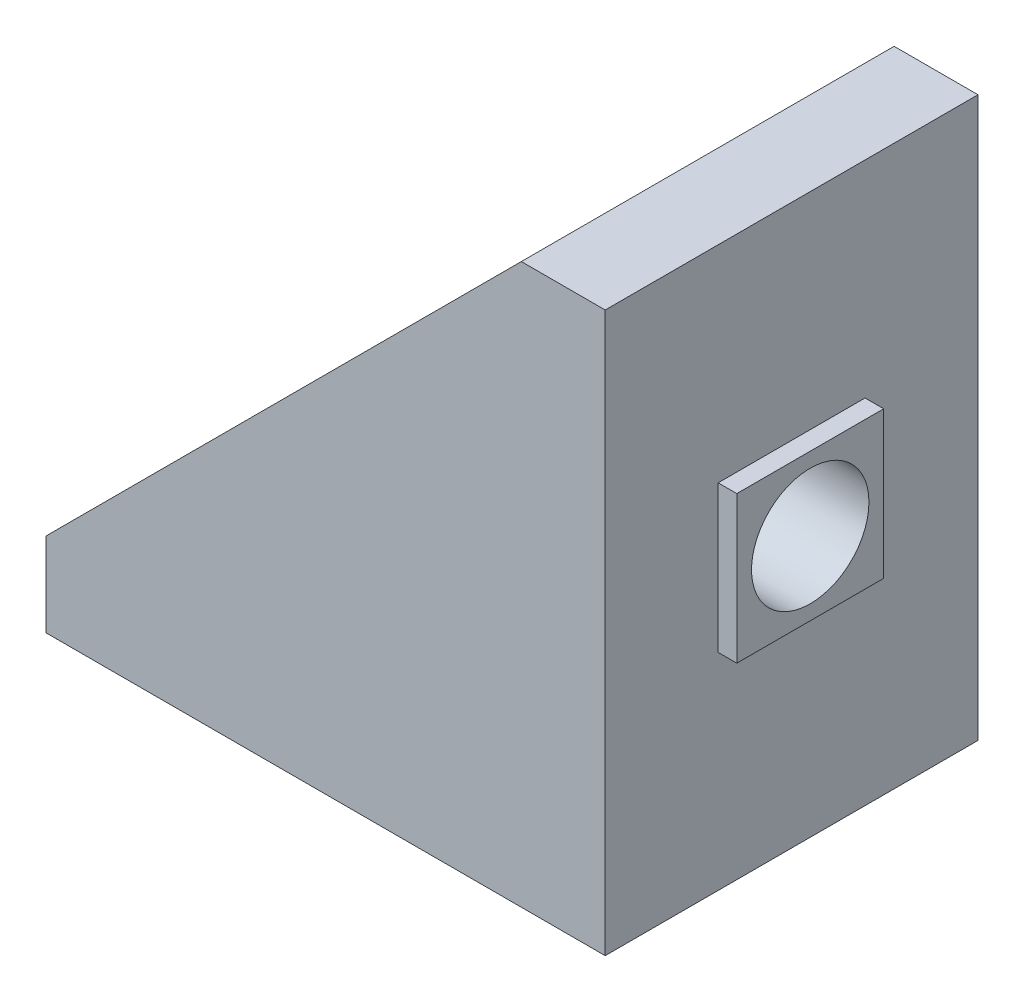
ISO-10303-21;
HEADER;
FILE_DESCRIPTION(('STEP AP214'),'2;1');
FILE_NAME('part.step','',(''),(''),'','','');
FILE_SCHEMA(('AUTOMOTIVE_DESIGN { 1 0 10303 214 1 1 1 1 }'));
ENDSEC;
DATA;
#1=APPLICATION_CONTEXT('core data for automotive mechanical design processes');
#2=APPLICATION_PROTOCOL_DEFINITION('international standard','automotive_design',2000,#1);
#3=PRODUCT_CONTEXT('',#1,'mechanical');
#4=PRODUCT('Part','Part','',(#3));
#5=PRODUCT_RELATED_PRODUCT_CATEGORY('part','',(#4));
#6=PRODUCT_DEFINITION_FORMATION('','',#4);
#7=PRODUCT_DEFINITION_CONTEXT('part definition',#1,'design');
#8=PRODUCT_DEFINITION('design','',#6,#7);
#9=PRODUCT_DEFINITION_SHAPE('','',#8);
#10=(LENGTH_UNIT() NAMED_UNIT(*) SI_UNIT(.MILLI.,.METRE.));
#11=(NAMED_UNIT(*) PLANE_ANGLE_UNIT() SI_UNIT($,.RADIAN.));
#12=(NAMED_UNIT(*) SI_UNIT($,.STERADIAN.) SOLID_ANGLE_UNIT());
#13=UNCERTAINTY_MEASURE_WITH_UNIT(LENGTH_MEASURE(1.E-05),#10,'distance_accuracy_value','');
#14=(GEOMETRIC_REPRESENTATION_CONTEXT(3) GLOBAL_UNCERTAINTY_ASSIGNED_CONTEXT((#13)) GLOBAL_UNIT_ASSIGNED_CONTEXT((#10,
#11,#12)) REPRESENTATION_CONTEXT('',''));
#15=CARTESIAN_POINT('',(0.,0.,0.));
#16=DIRECTION('',(0.,0.,1.));
#17=DIRECTION('',(1.,0.,0.));
#18=AXIS2_PLACEMENT_3D('',#15,#16,#17);
#19=CARTESIAN_POINT('',(-30.,0.,20.));
#20=DIRECTION('',(0.,1.,0.));
#21=DIRECTION('',(0.,0.,1.));
#22=AXIS2_PLACEMENT_3D('',#19,#20,#21);
#23=PLANE('',#22);
#24=CARTESIAN_POINT('',(-18.,0.,10.));
#25=DIRECTION('',(0.,-1.,0.));
#26=DIRECTION('',(0.,0.,-1.));
#27=AXIS2_PLACEMENT_3D('',#24,#25,#26);
#28=CIRCLE('',#27,3.15);
#29=CARTESIAN_POINT('',(-18.,0.,6.85));
#30=VERTEX_POINT('',#29);
#31=EDGE_CURVE('E473',#30,#30,#28,.T.);
#32=ORIENTED_EDGE('',*,*,#31,.F.);
#33=EDGE_LOOP('',(#32));
#34=FACE_BOUND('',#33,.T.);
#35=DIRECTION('',(0.,0.,-1.));
#36=VECTOR('',#35,1.);
#37=CARTESIAN_POINT('',(-25.8,0.,13.85));
#38=LINE('',#37,#36);
#39=CARTESIAN_POINT('',(-25.8,0.,13.85));
#40=VERTEX_POINT('',#39);
#41=CARTESIAN_POINT('',(-25.8,0.,6.15));
#42=VERTEX_POINT('',#41);
#43=EDGE_CURVE('E194',#40,#42,#38,.T.);
#44=ORIENTED_EDGE('',*,*,#43,.F.);
#45=DIRECTION('',(-1.,0.,0.));
#46=VECTOR('',#45,1.);
#47=CARTESIAN_POINT('',(-23.8,0.,13.85));
#48=LINE('',#47,#46);
#49=CARTESIAN_POINT('',(-23.8,0.,13.85));
#50=VERTEX_POINT('',#49);
#51=EDGE_CURVE('E207',#50,#40,#48,.T.);
#52=ORIENTED_EDGE('',*,*,#51,.F.);
#53=DIRECTION('',(0.,0.,1.));
#54=VECTOR('',#53,1.);
#55=CARTESIAN_POINT('',(-23.8,0.,13.85));
#56=LINE('',#55,#54);
#57=CARTESIAN_POINT('',(-23.8,0.,6.15));
#58=VERTEX_POINT('',#57);
#59=EDGE_CURVE('E216',#58,#50,#56,.T.);
#60=ORIENTED_EDGE('',*,*,#59,.F.);
#61=DIRECTION('',(1.,0.,0.));
#62=VECTOR('',#61,1.);
#63=CARTESIAN_POINT('',(-23.8,0.,6.15));
#64=LINE('',#63,#62);
#65=EDGE_CURVE('E197',#42,#58,#64,.T.);
#66=ORIENTED_EDGE('',*,*,#65,.F.);
#67=EDGE_LOOP('',(#44,#52,#60,#66));
#68=FACE_BOUND('',#67,.T.);
#69=DIRECTION('',(1.,0.,0.));
#70=VECTOR('',#69,1.);
#71=CARTESIAN_POINT('',(-30.,0.,0.));
#72=LINE('',#71,#70);
#73=CARTESIAN_POINT('',(-30.,0.,0.));
#74=VERTEX_POINT('',#73);
#75=CARTESIAN_POINT('',(0.,0.,0.));
#76=VERTEX_POINT('',#75);
#77=EDGE_CURVE('E316',#74,#76,#72,.T.);
#78=ORIENTED_EDGE('',*,*,#77,.T.);
#79=DIRECTION('',(0.,0.,-1.));
#80=VECTOR('',#79,1.);
#81=CARTESIAN_POINT('',(0.,0.,20.));
#82=LINE('',#81,#80);
#83=CARTESIAN_POINT('',(0.,0.,20.));
#84=VERTEX_POINT('',#83);
#85=EDGE_CURVE('E321',#84,#76,#82,.T.);
#86=ORIENTED_EDGE('',*,*,#85,.F.);
#87=DIRECTION('',(1.,0.,0.));
#88=VECTOR('',#87,1.);
#89=CARTESIAN_POINT('',(-30.,0.,20.));
#90=LINE('',#89,#88);
#91=CARTESIAN_POINT('',(-30.,0.,20.));
#92=VERTEX_POINT('',#91);
#93=EDGE_CURVE('E304',#92,#84,#90,.T.);
#94=ORIENTED_EDGE('',*,*,#93,.F.);
#95=DIRECTION('',(0.,0.,-1.));
#96=VECTOR('',#95,1.);
#97=CARTESIAN_POINT('',(-30.,0.,20.));
#98=LINE('',#97,#96);
#99=EDGE_CURVE('E324',#92,#74,#98,.T.);
#100=ORIENTED_EDGE('',*,*,#99,.T.);
#101=EDGE_LOOP('',(#78,#86,#94,#100));
#102=FACE_BOUND('',#101,.T.);
#103=DIRECTION('',(0.,0.,-1.));
#104=VECTOR('',#103,1.);
#105=CARTESIAN_POINT('',(-9.6,0.,13.85));
#106=LINE('',#105,#104);
#107=CARTESIAN_POINT('',(-9.6,0.,13.85));
#108=VERTEX_POINT('',#107);
#109=CARTESIAN_POINT('',(-9.6,0.,6.15));
#110=VERTEX_POINT('',#109);
#111=EDGE_CURVE('E193',#108,#110,#106,.T.);
#112=ORIENTED_EDGE('',*,*,#111,.F.);
#113=DIRECTION('',(-1.,0.,0.));
#114=VECTOR('',#113,1.);
#115=CARTESIAN_POINT('',(-4.59999999999999,0.,13.85));
#116=LINE('',#115,#114);
#117=CARTESIAN_POINT('',(-4.59999999999999,0.,13.85));
#118=VERTEX_POINT('',#117);
#119=EDGE_CURVE('E190',#118,#108,#116,.T.);
#120=ORIENTED_EDGE('',*,*,#119,.F.);
#121=DIRECTION('',(0.,0.,1.));
#122=VECTOR('',#121,1.);
#123=CARTESIAN_POINT('',(-4.59999999999999,0.,13.85));
#124=LINE('',#123,#122);
#125=CARTESIAN_POINT('',(-4.59999999999999,0.,6.15));
#126=VERTEX_POINT('',#125);
#127=EDGE_CURVE('E56',#126,#118,#124,.T.);
#128=ORIENTED_EDGE('',*,*,#127,.F.);
#129=DIRECTION('',(1.,0.,0.));
#130=VECTOR('',#129,1.);
#131=CARTESIAN_POINT('',(-4.59999999999999,0.,6.15));
#132=LINE('',#131,#130);
#133=EDGE_CURVE('E51',#110,#126,#132,.T.);
#134=ORIENTED_EDGE('',*,*,#133,.F.);
#135=EDGE_LOOP('',(#112,#120,#128,#134));
#136=FACE_BOUND('',#135,.T.);
#137=ADVANCED_FACE('F35',(#34,#68,#102,#136),#23,.F.);
#138=CARTESIAN_POINT('',(0.,0.,20.));
#139=DIRECTION('',(-1.,0.,0.));
#140=DIRECTION('',(0.,0.,1.));
#141=AXIS2_PLACEMENT_3D('',#138,#139,#140);
#142=PLANE('',#141);
#143=DIRECTION('',(0.,1.,0.));
#144=VECTOR('',#143,1.);
#145=CARTESIAN_POINT('',(0.,0.,0.));
#146=LINE('',#145,#144);
#147=CARTESIAN_POINT('',(0.,30.,0.));
#148=VERTEX_POINT('',#147);
#149=EDGE_CURVE('E300',#76,#148,#146,.T.);
#150=ORIENTED_EDGE('',*,*,#149,.T.);
#151=DIRECTION('',(0.,0.,-1.));
#152=VECTOR('',#151,1.);
#153=CARTESIAN_POINT('',(0.,30.,20.));
#154=LINE('',#153,#152);
#155=CARTESIAN_POINT('',(0.,30.,20.));
#156=VERTEX_POINT('',#155);
#157=EDGE_CURVE('E308',#156,#148,#154,.T.);
#158=ORIENTED_EDGE('',*,*,#157,.F.);
#159=DIRECTION('',(0.,1.,0.));
#160=VECTOR('',#159,1.);
#161=CARTESIAN_POINT('',(0.,0.,20.));
#162=LINE('',#161,#160);
#163=EDGE_CURVE('E306',#84,#156,#162,.T.);
#164=ORIENTED_EDGE('',*,*,#163,.F.);
#165=ORIENTED_EDGE('',*,*,#85,.T.);
#166=EDGE_LOOP('',(#150,#158,#164,#165));
#167=FACE_BOUND('',#166,.T.);
#168=DIRECTION('',(0.,1.,0.));
#169=VECTOR('',#168,1.);
#170=CARTESIAN_POINT('',(0.,18.94,6.05999999999999));
#171=LINE('',#170,#169);
#172=CARTESIAN_POINT('',(0.,11.06,6.05999999999999));
#173=VERTEX_POINT('',#172);
#174=CARTESIAN_POINT('',(0.,18.94,6.05999999999999));
#175=VERTEX_POINT('',#174);
#176=EDGE_CURVE('E238',#173,#175,#171,.T.);
#177=ORIENTED_EDGE('',*,*,#176,.F.);
#178=DIRECTION('',(0.,0.,-1.));
#179=VECTOR('',#178,1.);
#180=CARTESIAN_POINT('',(0.,11.06,13.94));
#181=LINE('',#180,#179);
#182=CARTESIAN_POINT('',(0.,11.06,13.94));
#183=VERTEX_POINT('',#182);
#184=EDGE_CURVE('E243',#183,#173,#181,.T.);
#185=ORIENTED_EDGE('',*,*,#184,.F.);
#186=DIRECTION('',(0.,-1.,0.));
#187=VECTOR('',#186,1.);
#188=CARTESIAN_POINT('',(0.,18.94,13.94));
#189=LINE('',#188,#187);
#190=CARTESIAN_POINT('',(0.,18.94,13.94));
#191=VERTEX_POINT('',#190);
#192=EDGE_CURVE('E255',#191,#183,#189,.T.);
#193=ORIENTED_EDGE('',*,*,#192,.F.);
#194=DIRECTION('',(0.,0.,1.));
#195=VECTOR('',#194,1.);
#196=CARTESIAN_POINT('',(0.,18.94,13.94));
#197=LINE('',#196,#195);
#198=EDGE_CURVE('E252',#175,#191,#197,.T.);
#199=ORIENTED_EDGE('',*,*,#198,.F.);
#200=EDGE_LOOP('',(#177,#185,#193,#199));
#201=FACE_BOUND('',#200,.T.);
#202=ADVANCED_FACE('F352',(#167,#201),#142,.F.);
#203=CARTESIAN_POINT('',(-4.5,30.,20.));
#204=DIRECTION('',(0.707106781186548,-0.707106781186548,0.));
#205=DIRECTION('',(0.707106781186548,0.707106781186548,0.));
#206=AXIS2_PLACEMENT_3D('',#203,#204,#205);
#207=PLANE('',#206);
#208=DIRECTION('',(0.707106781186548,0.707106781186548,0.));
#209=VECTOR('',#208,1.);
#210=CARTESIAN_POINT('',(-30.,4.5,2.));
#211=LINE('',#210,#209);
#212=CARTESIAN_POINT('',(-30.,4.5,2.));
#213=VERTEX_POINT('',#212);
#214=CARTESIAN_POINT('',(-4.5,30.,2.));
#215=VERTEX_POINT('',#214);
#216=EDGE_CURVE('E274',#213,#215,#211,.T.);
#217=ORIENTED_EDGE('',*,*,#216,.T.);
#218=DIRECTION('',(0.,0.,-1.));
#219=VECTOR('',#218,1.);
#220=CARTESIAN_POINT('',(-4.5,30.,20.));
#221=LINE('',#220,#219);
#222=CARTESIAN_POINT('',(-4.5,30.,0.));
#223=VERTEX_POINT('',#222);
#224=EDGE_CURVE('E44',#215,#223,#221,.T.);
#225=ORIENTED_EDGE('',*,*,#224,.T.);
#226=DIRECTION('',(-0.707106781186548,-0.707106781186548,0.));
#227=VECTOR('',#226,1.);
#228=CARTESIAN_POINT('',(-4.5,30.,0.));
#229=LINE('',#228,#227);
#230=CARTESIAN_POINT('',(-30.,4.5,0.));
#231=VERTEX_POINT('',#230);
#232=EDGE_CURVE('E311',#223,#231,#229,.T.);
#233=ORIENTED_EDGE('',*,*,#232,.T.);
#234=DIRECTION('',(0.,0.,-1.));
#235=VECTOR('',#234,1.);
#236=CARTESIAN_POINT('',(-30.,4.5,20.));
#237=LINE('',#236,#235);
#238=EDGE_CURVE('E327',#213,#231,#237,.T.);
#239=ORIENTED_EDGE('',*,*,#238,.F.);
#240=EDGE_LOOP('',(#217,#225,#233,#239));
#241=FACE_BOUND('',#240,.T.);
#242=ADVANCED_FACE('F340',(#241),#207,.F.);
#243=CARTESIAN_POINT('',(0.,30.,20.));
#244=DIRECTION('',(0.,-1.,0.));
#245=DIRECTION('',(0.,0.,-1.));
#246=AXIS2_PLACEMENT_3D('',#243,#244,#245);
#247=PLANE('',#246);
#248=DIRECTION('',(-1.,0.,0.));
#249=VECTOR('',#248,1.);
#250=CARTESIAN_POINT('',(0.,30.,0.));
#251=LINE('',#250,#249);
#252=EDGE_CURVE('E295',#148,#223,#251,.T.);
#253=ORIENTED_EDGE('',*,*,#252,.T.);
#254=ORIENTED_EDGE('',*,*,#224,.F.);
#255=DIRECTION('',(0.,0.,1.));
#256=VECTOR('',#255,1.);
#257=CARTESIAN_POINT('',(-4.5,30.,-36.0624458405139));
#258=LINE('',#257,#256);
#259=CARTESIAN_POINT('',(-4.5,30.,18.));
#260=VERTEX_POINT('',#259);
#261=EDGE_CURVE('E275',#215,#260,#258,.T.);
#262=ORIENTED_EDGE('',*,*,#261,.T.);
#263=CARTESIAN_POINT('',(-4.5,30.,20.));
#264=VERTEX_POINT('',#263);
#265=EDGE_CURVE('E12',#264,#260,#221,.T.);
#266=ORIENTED_EDGE('',*,*,#265,.F.);
#267=DIRECTION('',(-1.,0.,0.));
#268=VECTOR('',#267,1.);
#269=CARTESIAN_POINT('',(0.,30.,20.));
#270=LINE('',#269,#268);
#271=EDGE_CURVE('E296',#156,#264,#270,.T.);
#272=ORIENTED_EDGE('',*,*,#271,.F.);
#273=ORIENTED_EDGE('',*,*,#157,.T.);
#274=EDGE_LOOP('',(#253,#254,#262,#266,#272,#273));
#275=FACE_BOUND('',#274,.T.);
#276=ADVANCED_FACE('F37',(#275),#247,.F.);
#277=ORIENTED_EDGE('',*,*,#265,.T.);
#278=DIRECTION('',(-0.707106781186548,-0.707106781186548,0.));
#279=VECTOR('',#278,1.);
#280=CARTESIAN_POINT('',(-30.,4.5,18.));
#281=LINE('',#280,#279);
#282=CARTESIAN_POINT('',(-30.,4.5,18.));
#283=VERTEX_POINT('',#282);
#284=EDGE_CURVE('E271',#260,#283,#281,.T.);
#285=ORIENTED_EDGE('',*,*,#284,.T.);
#286=CARTESIAN_POINT('',(-30.,4.5,20.));
#287=VERTEX_POINT('',#286);
#288=EDGE_CURVE('E328',#287,#283,#237,.T.);
#289=ORIENTED_EDGE('',*,*,#288,.F.);
#290=DIRECTION('',(-0.707106781186548,-0.707106781186548,0.));
#291=VECTOR('',#290,1.);
#292=CARTESIAN_POINT('',(-4.5,30.,20.));
#293=LINE('',#292,#291);
#294=EDGE_CURVE('E299',#264,#287,#293,.T.);
#295=ORIENTED_EDGE('',*,*,#294,.F.);
#296=EDGE_LOOP('',(#277,#285,#289,#295));
#297=FACE_BOUND('',#296,.T.);
#298=ADVANCED_FACE('F360',(#297),#207,.F.);
#299=CARTESIAN_POINT('',(-30.,4.5,20.));
#300=DIRECTION('',(1.,0.,0.));
#301=DIRECTION('',(0.,0.,-1.));
#302=AXIS2_PLACEMENT_3D('',#299,#300,#301);
#303=PLANE('',#302);
#304=DIRECTION('',(0.,-1.,0.));
#305=VECTOR('',#304,1.);
#306=CARTESIAN_POINT('',(-30.,4.5,0.));
#307=LINE('',#306,#305);
#308=EDGE_CURVE('E314',#231,#74,#307,.T.);
#309=ORIENTED_EDGE('',*,*,#308,.T.);
#310=ORIENTED_EDGE('',*,*,#99,.F.);
#311=DIRECTION('',(0.,-1.,0.));
#312=VECTOR('',#311,1.);
#313=CARTESIAN_POINT('',(-30.,4.5,20.));
#314=LINE('',#313,#312);
#315=EDGE_CURVE('E302',#287,#92,#314,.T.);
#316=ORIENTED_EDGE('',*,*,#315,.F.);
#317=ORIENTED_EDGE('',*,*,#288,.T.);
#318=DIRECTION('',(0.,0.,1.));
#319=VECTOR('',#318,1.);
#320=CARTESIAN_POINT('',(-30.,4.5,-36.0624458405139));
#321=LINE('',#320,#319);
#322=EDGE_CURVE('E287',#213,#283,#321,.T.);
#323=ORIENTED_EDGE('',*,*,#322,.F.);
#324=ORIENTED_EDGE('',*,*,#238,.T.);
#325=EDGE_LOOP('',(#309,#310,#316,#317,#323,#324));
#326=FACE_BOUND('',#325,.T.);
#327=ADVANCED_FACE('F335',(#326),#303,.F.);
#328=CARTESIAN_POINT('',(0.,0.,20.));
#329=DIRECTION('',(0.,0.,1.));
#330=DIRECTION('',(1.,0.,0.));
#331=AXIS2_PLACEMENT_3D('',#328,#329,#330);
#332=PLANE('',#331);
#333=ORIENTED_EDGE('',*,*,#271,.T.);
#334=ORIENTED_EDGE('',*,*,#294,.T.);
#335=ORIENTED_EDGE('',*,*,#315,.T.);
#336=ORIENTED_EDGE('',*,*,#93,.T.);
#337=ORIENTED_EDGE('',*,*,#163,.T.);
#338=EDGE_LOOP('',(#333,#334,#335,#336,#337));
#339=FACE_BOUND('',#338,.T.);
#340=ADVANCED_FACE('F357',(#339),#332,.T.);
#341=CARTESIAN_POINT('',(0.,0.,0.));
#342=DIRECTION('',(0.,0.,1.));
#343=DIRECTION('',(1.,0.,0.));
#344=AXIS2_PLACEMENT_3D('',#341,#342,#343);
#345=PLANE('',#344);
#346=ORIENTED_EDGE('',*,*,#252,.F.);
#347=ORIENTED_EDGE('',*,*,#149,.F.);
#348=ORIENTED_EDGE('',*,*,#77,.F.);
#349=ORIENTED_EDGE('',*,*,#308,.F.);
#350=ORIENTED_EDGE('',*,*,#232,.F.);
#351=EDGE_LOOP('',(#346,#347,#348,#349,#350));
#352=FACE_BOUND('',#351,.T.);
#353=ADVANCED_FACE('F345',(#352),#345,.F.);
#354=CARTESIAN_POINT('',(-4.5,4.5,-36.0624458405139));
#355=DIRECTION('',(1.,0.,0.));
#356=DIRECTION('',(0.,0.,-1.));
#357=AXIS2_PLACEMENT_3D('',#354,#355,#356);
#358=PLANE('',#357);
#359=CARTESIAN_POINT('',(-4.5,15.,9.99999999999999));
#360=DIRECTION('',(1.,0.,0.));
#361=DIRECTION('',(0.,0.,-1.));
#362=AXIS2_PLACEMENT_3D('',#359,#360,#361);
#363=CIRCLE('',#362,3.15);
#364=CARTESIAN_POINT('',(-4.5,15.,6.84999999999999));
#365=VERTEX_POINT('',#364);
#366=EDGE_CURVE('E235',#365,#365,#363,.T.);
#367=ORIENTED_EDGE('',*,*,#366,.T.);
#368=EDGE_LOOP('',(#367));
#369=FACE_BOUND('',#368,.T.);
#370=DIRECTION('',(0.,-1.,0.));
#371=VECTOR('',#370,1.);
#372=CARTESIAN_POINT('',(-4.5,4.5,2.));
#373=LINE('',#372,#371);
#374=CARTESIAN_POINT('',(-4.5,4.5,2.));
#375=VERTEX_POINT('',#374);
#376=EDGE_CURVE('E272',#215,#375,#373,.T.);
#377=ORIENTED_EDGE('',*,*,#376,.T.);
#378=DIRECTION('',(0.,0.,1.));
#379=VECTOR('',#378,1.);
#380=CARTESIAN_POINT('',(-4.5,4.5,-36.0624458405139));
#381=LINE('',#380,#379);
#382=CARTESIAN_POINT('',(-4.5,4.5,18.));
#383=VERTEX_POINT('',#382);
#384=EDGE_CURVE('E290',#375,#383,#381,.T.);
#385=ORIENTED_EDGE('',*,*,#384,.T.);
#386=DIRECTION('',(0.,1.,0.));
#387=VECTOR('',#386,1.);
#388=CARTESIAN_POINT('',(-4.5,4.5,18.));
#389=LINE('',#388,#387);
#390=EDGE_CURVE('E284',#383,#260,#389,.T.);
#391=ORIENTED_EDGE('',*,*,#390,.T.);
#392=ORIENTED_EDGE('',*,*,#261,.F.);
#393=EDGE_LOOP('',(#377,#385,#391,#392));
#394=FACE_BOUND('',#393,.T.);
#395=ADVANCED_FACE('F367',(#369,#394),#358,.F.);
#396=CARTESIAN_POINT('',(-30.,4.5,-36.0624458405139));
#397=DIRECTION('',(0.,-1.,0.));
#398=DIRECTION('',(0.,0.,-1.));
#399=AXIS2_PLACEMENT_3D('',#396,#397,#398);
#400=PLANE('',#399);
#401=CARTESIAN_POINT('',(-18.,4.5,10.));
#402=DIRECTION('',(0.,-1.,0.));
#403=DIRECTION('',(0.,0.,-1.));
#404=AXIS2_PLACEMENT_3D('',#401,#402,#403);
#405=CIRCLE('',#404,3.15);
#406=CARTESIAN_POINT('',(-18.,4.5,6.85));
#407=VERTEX_POINT('',#406);
#408=EDGE_CURVE('E39',#407,#407,#405,.T.);
#409=ORIENTED_EDGE('',*,*,#408,.T.);
#410=EDGE_LOOP('',(#409));
#411=FACE_BOUND('',#410,.T.);
#412=DIRECTION('',(-1.,0.,0.));
#413=VECTOR('',#412,1.);
#414=CARTESIAN_POINT('',(-30.,4.5,2.));
#415=LINE('',#414,#413);
#416=EDGE_CURVE('E278',#375,#213,#415,.T.);
#417=ORIENTED_EDGE('',*,*,#416,.T.);
#418=ORIENTED_EDGE('',*,*,#322,.T.);
#419=DIRECTION('',(1.,0.,0.));
#420=VECTOR('',#419,1.);
#421=CARTESIAN_POINT('',(-30.,4.5,18.));
#422=LINE('',#421,#420);
#423=EDGE_CURVE('E281',#283,#383,#422,.T.);
#424=ORIENTED_EDGE('',*,*,#423,.T.);
#425=ORIENTED_EDGE('',*,*,#384,.F.);
#426=EDGE_LOOP('',(#417,#418,#424,#425));
#427=FACE_BOUND('',#426,.T.);
#428=ADVANCED_FACE('F395',(#411,#427),#400,.F.);
#429=CARTESIAN_POINT('',(0.,0.,18.));
#430=DIRECTION('',(0.,0.,1.));
#431=DIRECTION('',(1.,0.,0.));
#432=AXIS2_PLACEMENT_3D('',#429,#430,#431);
#433=PLANE('',#432);
#434=ORIENTED_EDGE('',*,*,#284,.F.);
#435=ORIENTED_EDGE('',*,*,#390,.F.);
#436=ORIENTED_EDGE('',*,*,#423,.F.);
#437=EDGE_LOOP('',(#434,#435,#436));
#438=FACE_BOUND('',#437,.T.);
#439=ADVANCED_FACE('F364',(#438),#433,.F.);
#440=CARTESIAN_POINT('',(0.,0.,2.));
#441=DIRECTION('',(0.,0.,1.));
#442=DIRECTION('',(1.,0.,0.));
#443=AXIS2_PLACEMENT_3D('',#440,#441,#442);
#444=PLANE('',#443);
#445=ORIENTED_EDGE('',*,*,#216,.F.);
#446=ORIENTED_EDGE('',*,*,#416,.F.);
#447=ORIENTED_EDGE('',*,*,#376,.F.);
#448=EDGE_LOOP('',(#445,#446,#447));
#449=FACE_BOUND('',#448,.T.);
#450=ADVANCED_FACE('F404',(#449),#444,.T.);
#451=CARTESIAN_POINT('',(1.,18.94,6.05999999999999));
#452=DIRECTION('',(0.,0.,1.));
#453=DIRECTION('',(0.,-1.,0.));
#454=AXIS2_PLACEMENT_3D('',#451,#452,#453);
#455=PLANE('',#454);
#456=ORIENTED_EDGE('',*,*,#176,.T.);
#457=DIRECTION('',(-1.,0.,0.));
#458=VECTOR('',#457,1.);
#459=CARTESIAN_POINT('',(1.,18.94,6.05999999999999));
#460=LINE('',#459,#458);
#461=CARTESIAN_POINT('',(1.,18.94,6.05999999999999));
#462=VERTEX_POINT('',#461);
#463=EDGE_CURVE('E268',#462,#175,#460,.T.);
#464=ORIENTED_EDGE('',*,*,#463,.F.);
#465=DIRECTION('',(0.,1.,0.));
#466=VECTOR('',#465,1.);
#467=CARTESIAN_POINT('',(1.,18.94,6.05999999999999));
#468=LINE('',#467,#466);
#469=CARTESIAN_POINT('',(1.,11.06,6.05999999999999));
#470=VERTEX_POINT('',#469);
#471=EDGE_CURVE('E239',#470,#462,#468,.T.);
#472=ORIENTED_EDGE('',*,*,#471,.F.);
#473=DIRECTION('',(-1.,0.,0.));
#474=VECTOR('',#473,1.);
#475=CARTESIAN_POINT('',(1.,11.06,6.05999999999999));
#476=LINE('',#475,#474);
#477=EDGE_CURVE('E249',#470,#173,#476,.T.);
#478=ORIENTED_EDGE('',*,*,#477,.T.);
#479=EDGE_LOOP('',(#456,#464,#472,#478));
#480=FACE_BOUND('',#479,.T.);
#481=ADVANCED_FACE('F407',(#480),#455,.F.);
#482=CARTESIAN_POINT('',(1.,18.94,13.94));
#483=DIRECTION('',(0.,-1.,0.));
#484=DIRECTION('',(0.,0.,-1.));
#485=AXIS2_PLACEMENT_3D('',#482,#483,#484);
#486=PLANE('',#485);
#487=ORIENTED_EDGE('',*,*,#198,.T.);
#488=DIRECTION('',(-1.,0.,0.));
#489=VECTOR('',#488,1.);
#490=CARTESIAN_POINT('',(1.,18.94,13.94));
#491=LINE('',#490,#489);
#492=CARTESIAN_POINT('',(1.,18.94,13.94));
#493=VERTEX_POINT('',#492);
#494=EDGE_CURVE('E265',#493,#191,#491,.T.);
#495=ORIENTED_EDGE('',*,*,#494,.F.);
#496=DIRECTION('',(0.,0.,1.));
#497=VECTOR('',#496,1.);
#498=CARTESIAN_POINT('',(1.,18.94,13.94));
#499=LINE('',#498,#497);
#500=EDGE_CURVE('E242',#462,#493,#499,.T.);
#501=ORIENTED_EDGE('',*,*,#500,.F.);
#502=ORIENTED_EDGE('',*,*,#463,.T.);
#503=EDGE_LOOP('',(#487,#495,#501,#502));
#504=FACE_BOUND('',#503,.T.);
#505=ADVANCED_FACE('F411',(#504),#486,.F.);
#506=CARTESIAN_POINT('',(1.,18.94,13.94));
#507=DIRECTION('',(0.,0.,-1.));
#508=DIRECTION('',(0.,1.,0.));
#509=AXIS2_PLACEMENT_3D('',#506,#507,#508);
#510=PLANE('',#509);
#511=ORIENTED_EDGE('',*,*,#192,.T.);
#512=DIRECTION('',(-1.,0.,0.));
#513=VECTOR('',#512,1.);
#514=CARTESIAN_POINT('',(1.,11.06,13.94));
#515=LINE('',#514,#513);
#516=CARTESIAN_POINT('',(1.,11.06,13.94));
#517=VERTEX_POINT('',#516);
#518=EDGE_CURVE('E262',#517,#183,#515,.T.);
#519=ORIENTED_EDGE('',*,*,#518,.F.);
#520=DIRECTION('',(0.,-1.,0.));
#521=VECTOR('',#520,1.);
#522=CARTESIAN_POINT('',(1.,18.94,13.94));
#523=LINE('',#522,#521);
#524=EDGE_CURVE('E245',#493,#517,#523,.T.);
#525=ORIENTED_EDGE('',*,*,#524,.F.);
#526=ORIENTED_EDGE('',*,*,#494,.T.);
#527=EDGE_LOOP('',(#511,#519,#525,#526));
#528=FACE_BOUND('',#527,.T.);
#529=ADVANCED_FACE('F415',(#528),#510,.F.);
#530=CARTESIAN_POINT('',(1.,11.06,13.94));
#531=DIRECTION('',(0.,1.,0.));
#532=DIRECTION('',(0.,0.,1.));
#533=AXIS2_PLACEMENT_3D('',#530,#531,#532);
#534=PLANE('',#533);
#535=ORIENTED_EDGE('',*,*,#184,.T.);
#536=ORIENTED_EDGE('',*,*,#477,.F.);
#537=DIRECTION('',(0.,0.,-1.));
#538=VECTOR('',#537,1.);
#539=CARTESIAN_POINT('',(1.,11.06,13.94));
#540=LINE('',#539,#538);
#541=EDGE_CURVE('E247',#517,#470,#540,.T.);
#542=ORIENTED_EDGE('',*,*,#541,.F.);
#543=ORIENTED_EDGE('',*,*,#518,.T.);
#544=EDGE_LOOP('',(#535,#536,#542,#543));
#545=FACE_BOUND('',#544,.T.);
#546=ADVANCED_FACE('F419',(#545),#534,.F.);
#547=CARTESIAN_POINT('',(1.,0.,0.));
#548=DIRECTION('',(1.,0.,0.));
#549=DIRECTION('',(0.,0.,-1.));
#550=AXIS2_PLACEMENT_3D('',#547,#548,#549);
#551=PLANE('',#550);
#552=CARTESIAN_POINT('',(1.,15.,9.99999999999999));
#553=DIRECTION('',(1.,0.,0.));
#554=DIRECTION('',(0.,0.,-1.));
#555=AXIS2_PLACEMENT_3D('',#552,#553,#554);
#556=CIRCLE('',#555,3.15);
#557=CARTESIAN_POINT('',(1.,15.,6.84999999999999));
#558=VERTEX_POINT('',#557);
#559=EDGE_CURVE('E232',#558,#558,#556,.T.);
#560=ORIENTED_EDGE('',*,*,#559,.F.);
#561=EDGE_LOOP('',(#560));
#562=FACE_BOUND('',#561,.T.);
#563=ORIENTED_EDGE('',*,*,#471,.T.);
#564=ORIENTED_EDGE('',*,*,#500,.T.);
#565=ORIENTED_EDGE('',*,*,#524,.T.);
#566=ORIENTED_EDGE('',*,*,#541,.T.);
#567=EDGE_LOOP('',(#563,#564,#565,#566));
#568=FACE_BOUND('',#567,.T.);
#569=ADVANCED_FACE('F423',(#562,#568),#551,.T.);
#570=CARTESIAN_POINT('',(-30.,15.,9.99999999999999));
#571=DIRECTION('',(1.,0.,0.));
#572=DIRECTION('',(0.,0.,-1.));
#573=AXIS2_PLACEMENT_3D('',#570,#571,#572);
#574=CYLINDRICAL_SURFACE('',#573,3.15);
#575=ORIENTED_EDGE('',*,*,#559,.T.);
#576=EDGE_LOOP('',(#575));
#577=FACE_BOUND('',#576,.T.);
#578=ORIENTED_EDGE('',*,*,#366,.F.);
#579=EDGE_LOOP('',(#578));
#580=FACE_BOUND('',#579,.T.);
#581=ADVANCED_FACE('F427',(#577,#580),#574,.F.);
#582=CARTESIAN_POINT('',(-25.8,-1.,13.85));
#583=DIRECTION('',(1.,0.,0.));
#584=DIRECTION('',(0.,0.,-1.));
#585=AXIS2_PLACEMENT_3D('',#582,#583,#584);
#586=PLANE('',#585);
#587=ORIENTED_EDGE('',*,*,#43,.T.);
#588=DIRECTION('',(0.,1.,0.));
#589=VECTOR('',#588,1.);
#590=CARTESIAN_POINT('',(-25.8,-1.,6.15));
#591=LINE('',#590,#589);
#592=CARTESIAN_POINT('',(-25.8,-1.,6.15));
#593=VERTEX_POINT('',#592);
#594=EDGE_CURVE('E229',#593,#42,#591,.T.);
#595=ORIENTED_EDGE('',*,*,#594,.F.);
#596=DIRECTION('',(0.,0.,-1.));
#597=VECTOR('',#596,1.);
#598=CARTESIAN_POINT('',(-25.8,-1.,13.85));
#599=LINE('',#598,#597);
#600=CARTESIAN_POINT('',(-25.8,-1.,13.85));
#601=VERTEX_POINT('',#600);
#602=EDGE_CURVE('E203',#601,#593,#599,.T.);
#603=ORIENTED_EDGE('',*,*,#602,.F.);
#604=DIRECTION('',(0.,1.,0.));
#605=VECTOR('',#604,1.);
#606=CARTESIAN_POINT('',(-25.8,-1.,13.85));
#607=LINE('',#606,#605);
#608=EDGE_CURVE('E212',#601,#40,#607,.T.);
#609=ORIENTED_EDGE('',*,*,#608,.T.);
#610=EDGE_LOOP('',(#587,#595,#603,#609));
#611=FACE_BOUND('',#610,.T.);
#612=ADVANCED_FACE('F431',(#611),#586,.F.);
#613=CARTESIAN_POINT('',(-23.8,-1.,6.15));
#614=DIRECTION('',(0.,0.,1.));
#615=DIRECTION('',(1.,0.,0.));
#616=AXIS2_PLACEMENT_3D('',#613,#614,#615);
#617=PLANE('',#616);
#618=ORIENTED_EDGE('',*,*,#65,.T.);
#619=DIRECTION('',(0.,1.,0.));
#620=VECTOR('',#619,1.);
#621=CARTESIAN_POINT('',(-23.8,-1.,6.15));
#622=LINE('',#621,#620);
#623=CARTESIAN_POINT('',(-23.8,-1.,6.15));
#624=VERTEX_POINT('',#623);
#625=EDGE_CURVE('E226',#624,#58,#622,.T.);
#626=ORIENTED_EDGE('',*,*,#625,.F.);
#627=DIRECTION('',(1.,0.,0.));
#628=VECTOR('',#627,1.);
#629=CARTESIAN_POINT('',(-23.8,-1.,6.15));
#630=LINE('',#629,#628);
#631=EDGE_CURVE('E206',#593,#624,#630,.T.);
#632=ORIENTED_EDGE('',*,*,#631,.F.);
#633=ORIENTED_EDGE('',*,*,#594,.T.);
#634=EDGE_LOOP('',(#618,#626,#632,#633));
#635=FACE_BOUND('',#634,.T.);
#636=ADVANCED_FACE('F435',(#635),#617,.F.);
#637=CARTESIAN_POINT('',(-23.8,-1.,13.85));
#638=DIRECTION('',(-1.,0.,0.));
#639=DIRECTION('',(0.,0.,1.));
#640=AXIS2_PLACEMENT_3D('',#637,#638,#639);
#641=PLANE('',#640);
#642=ORIENTED_EDGE('',*,*,#59,.T.);
#643=DIRECTION('',(0.,1.,0.));
#644=VECTOR('',#643,1.);
#645=CARTESIAN_POINT('',(-23.8,-1.,13.85));
#646=LINE('',#645,#644);
#647=CARTESIAN_POINT('',(-23.8,-1.,13.85));
#648=VERTEX_POINT('',#647);
#649=EDGE_CURVE('E223',#648,#50,#646,.T.);
#650=ORIENTED_EDGE('',*,*,#649,.F.);
#651=DIRECTION('',(0.,0.,1.));
#652=VECTOR('',#651,1.);
#653=CARTESIAN_POINT('',(-23.8,-1.,13.85));
#654=LINE('',#653,#652);
#655=EDGE_CURVE('E209',#624,#648,#654,.T.);
#656=ORIENTED_EDGE('',*,*,#655,.F.);
#657=ORIENTED_EDGE('',*,*,#625,.T.);
#658=EDGE_LOOP('',(#642,#650,#656,#657));
#659=FACE_BOUND('',#658,.T.);
#660=ADVANCED_FACE('F439',(#659),#641,.F.);
#661=CARTESIAN_POINT('',(-23.8,-1.,13.85));
#662=DIRECTION('',(0.,0.,-1.));
#663=DIRECTION('',(-1.,0.,0.));
#664=AXIS2_PLACEMENT_3D('',#661,#662,#663);
#665=PLANE('',#664);
#666=ORIENTED_EDGE('',*,*,#51,.T.);
#667=ORIENTED_EDGE('',*,*,#608,.F.);
#668=DIRECTION('',(-1.,0.,0.));
#669=VECTOR('',#668,1.);
#670=CARTESIAN_POINT('',(-23.8,-1.,13.85));
#671=LINE('',#670,#669);
#672=EDGE_CURVE('E211',#648,#601,#671,.T.);
#673=ORIENTED_EDGE('',*,*,#672,.F.);
#674=ORIENTED_EDGE('',*,*,#649,.T.);
#675=EDGE_LOOP('',(#666,#667,#673,#674));
#676=FACE_BOUND('',#675,.T.);
#677=ADVANCED_FACE('F443',(#676),#665,.F.);
#678=CARTESIAN_POINT('',(0.,-1.,0.));
#679=DIRECTION('',(0.,1.,0.));
#680=DIRECTION('',(0.,0.,1.));
#681=AXIS2_PLACEMENT_3D('',#678,#679,#680);
#682=PLANE('',#681);
#683=ORIENTED_EDGE('',*,*,#602,.T.);
#684=ORIENTED_EDGE('',*,*,#631,.T.);
#685=ORIENTED_EDGE('',*,*,#655,.T.);
#686=ORIENTED_EDGE('',*,*,#672,.T.);
#687=EDGE_LOOP('',(#683,#684,#685,#686));
#688=FACE_BOUND('',#687,.T.);
#689=ADVANCED_FACE('F447',(#688),#682,.F.);
#690=CARTESIAN_POINT('',(-9.6,-1.,13.85));
#691=DIRECTION('',(1.,0.,0.));
#692=DIRECTION('',(0.,0.,-1.));
#693=AXIS2_PLACEMENT_3D('',#690,#691,#692);
#694=PLANE('',#693);
#695=ORIENTED_EDGE('',*,*,#111,.T.);
#696=DIRECTION('',(0.,1.,0.));
#697=VECTOR('',#696,1.);
#698=CARTESIAN_POINT('',(-9.6,-1.,6.15));
#699=LINE('',#698,#697);
#700=CARTESIAN_POINT('',(-9.6,-1.,6.15));
#701=VERTEX_POINT('',#700);
#702=EDGE_CURVE('E174',#701,#110,#699,.T.);
#703=ORIENTED_EDGE('',*,*,#702,.F.);
#704=DIRECTION('',(0.,0.,-1.));
#705=VECTOR('',#704,1.);
#706=CARTESIAN_POINT('',(-9.6,-1.,13.85));
#707=LINE('',#706,#705);
#708=CARTESIAN_POINT('',(-9.6,-1.,13.85));
#709=VERTEX_POINT('',#708);
#710=EDGE_CURVE('E181',#709,#701,#707,.T.);
#711=ORIENTED_EDGE('',*,*,#710,.F.);
#712=DIRECTION('',(0.,1.,0.));
#713=VECTOR('',#712,1.);
#714=CARTESIAN_POINT('',(-9.6,-1.,13.85));
#715=LINE('',#714,#713);
#716=EDGE_CURVE('E480',#709,#108,#715,.T.);
#717=ORIENTED_EDGE('',*,*,#716,.T.);
#718=EDGE_LOOP('',(#695,#703,#711,#717));
#719=FACE_BOUND('',#718,.T.);
#720=ADVANCED_FACE('F192',(#719),#694,.F.);
#721=CARTESIAN_POINT('',(-4.59999999999999,-1.,6.15));
#722=DIRECTION('',(0.,0.,1.));
#723=DIRECTION('',(1.,0.,0.));
#724=AXIS2_PLACEMENT_3D('',#721,#722,#723);
#725=PLANE('',#724);
#726=ORIENTED_EDGE('',*,*,#133,.T.);
#727=DIRECTION('',(0.,1.,0.));
#728=VECTOR('',#727,1.);
#729=CARTESIAN_POINT('',(-4.59999999999999,-1.,6.15));
#730=LINE('',#729,#728);
#731=CARTESIAN_POINT('',(-4.59999999999999,-1.,6.15));
#732=VERTEX_POINT('',#731);
#733=EDGE_CURVE('E177',#732,#126,#730,.T.);
#734=ORIENTED_EDGE('',*,*,#733,.F.);
#735=DIRECTION('',(1.,0.,0.));
#736=VECTOR('',#735,1.);
#737=CARTESIAN_POINT('',(-4.59999999999999,-1.,6.15));
#738=LINE('',#737,#736);
#739=EDGE_CURVE('E170',#701,#732,#738,.T.);
#740=ORIENTED_EDGE('',*,*,#739,.F.);
#741=ORIENTED_EDGE('',*,*,#702,.T.);
#742=EDGE_LOOP('',(#726,#734,#740,#741));
#743=FACE_BOUND('',#742,.T.);
#744=ADVANCED_FACE('F172',(#743),#725,.F.);
#745=CARTESIAN_POINT('',(-4.59999999999999,-1.,13.85));
#746=DIRECTION('',(-1.,0.,0.));
#747=DIRECTION('',(0.,0.,1.));
#748=AXIS2_PLACEMENT_3D('',#745,#746,#747);
#749=PLANE('',#748);
#750=ORIENTED_EDGE('',*,*,#127,.T.);
#751=DIRECTION('',(0.,1.,0.));
#752=VECTOR('',#751,1.);
#753=CARTESIAN_POINT('',(-4.59999999999999,-1.,13.85));
#754=LINE('',#753,#752);
#755=CARTESIAN_POINT('',(-4.59999999999999,-1.,13.85));
#756=VERTEX_POINT('',#755);
#757=EDGE_CURVE('E199',#756,#118,#754,.T.);
#758=ORIENTED_EDGE('',*,*,#757,.F.);
#759=DIRECTION('',(0.,0.,1.));
#760=VECTOR('',#759,1.);
#761=CARTESIAN_POINT('',(-4.59999999999999,-1.,13.85));
#762=LINE('',#761,#760);
#763=EDGE_CURVE('E180',#732,#756,#762,.T.);
#764=ORIENTED_EDGE('',*,*,#763,.F.);
#765=ORIENTED_EDGE('',*,*,#733,.T.);
#766=EDGE_LOOP('',(#750,#758,#764,#765));
#767=FACE_BOUND('',#766,.T.);
#768=ADVANCED_FACE('F456',(#767),#749,.F.);
#769=CARTESIAN_POINT('',(-4.59999999999999,-1.,13.85));
#770=DIRECTION('',(0.,0.,-1.));
#771=DIRECTION('',(-1.,0.,0.));
#772=AXIS2_PLACEMENT_3D('',#769,#770,#771);
#773=PLANE('',#772);
#774=ORIENTED_EDGE('',*,*,#119,.T.);
#775=ORIENTED_EDGE('',*,*,#716,.F.);
#776=DIRECTION('',(-1.,0.,0.));
#777=VECTOR('',#776,1.);
#778=CARTESIAN_POINT('',(-4.59999999999999,-1.,13.85));
#779=LINE('',#778,#777);
#780=EDGE_CURVE('E186',#756,#709,#779,.T.);
#781=ORIENTED_EDGE('',*,*,#780,.F.);
#782=ORIENTED_EDGE('',*,*,#757,.T.);
#783=EDGE_LOOP('',(#774,#775,#781,#782));
#784=FACE_BOUND('',#783,.T.);
#785=ADVANCED_FACE('F459',(#784),#773,.F.);
#786=CARTESIAN_POINT('',(0.,-1.,0.));
#787=DIRECTION('',(0.,1.,0.));
#788=DIRECTION('',(0.,0.,1.));
#789=AXIS2_PLACEMENT_3D('',#786,#787,#788);
#790=PLANE('',#789);
#791=ORIENTED_EDGE('',*,*,#710,.T.);
#792=ORIENTED_EDGE('',*,*,#739,.T.);
#793=ORIENTED_EDGE('',*,*,#763,.T.);
#794=ORIENTED_EDGE('',*,*,#780,.T.);
#795=EDGE_LOOP('',(#791,#792,#793,#794));
#796=FACE_BOUND('',#795,.T.);
#797=ADVANCED_FACE('F184',(#796),#790,.F.);
#798=CARTESIAN_POINT('',(-18.,30.,10.));
#799=DIRECTION('',(0.,-1.,0.));
#800=DIRECTION('',(0.,0.,-1.));
#801=AXIS2_PLACEMENT_3D('',#798,#799,#800);
#802=CYLINDRICAL_SURFACE('',#801,3.15);
#803=ORIENTED_EDGE('',*,*,#31,.T.);
#804=EDGE_LOOP('',(#803));
#805=FACE_BOUND('',#804,.T.);
#806=ORIENTED_EDGE('',*,*,#408,.F.);
#807=EDGE_LOOP('',(#806));
#808=FACE_BOUND('',#807,.T.);
#809=ADVANCED_FACE('F466',(#805,#808),#802,.F.);
#810=CLOSED_SHELL('',(#137,#202,#242,#276,#298,#327,#340,#353,#395,#428,#439,#450,#481,#505,
#529,#546,#569,#581,#612,#636,#660,#677,#689,#720,#744,#768,#785,#797,#809));
#811=MANIFOLD_SOLID_BREP('B2',#810);
#812=ADVANCED_BREP_SHAPE_REPRESENTATION('',(#18,#811),#14);
#813=SHAPE_DEFINITION_REPRESENTATION(#9,#812);
ENDSEC;
END-ISO-10303-21;
